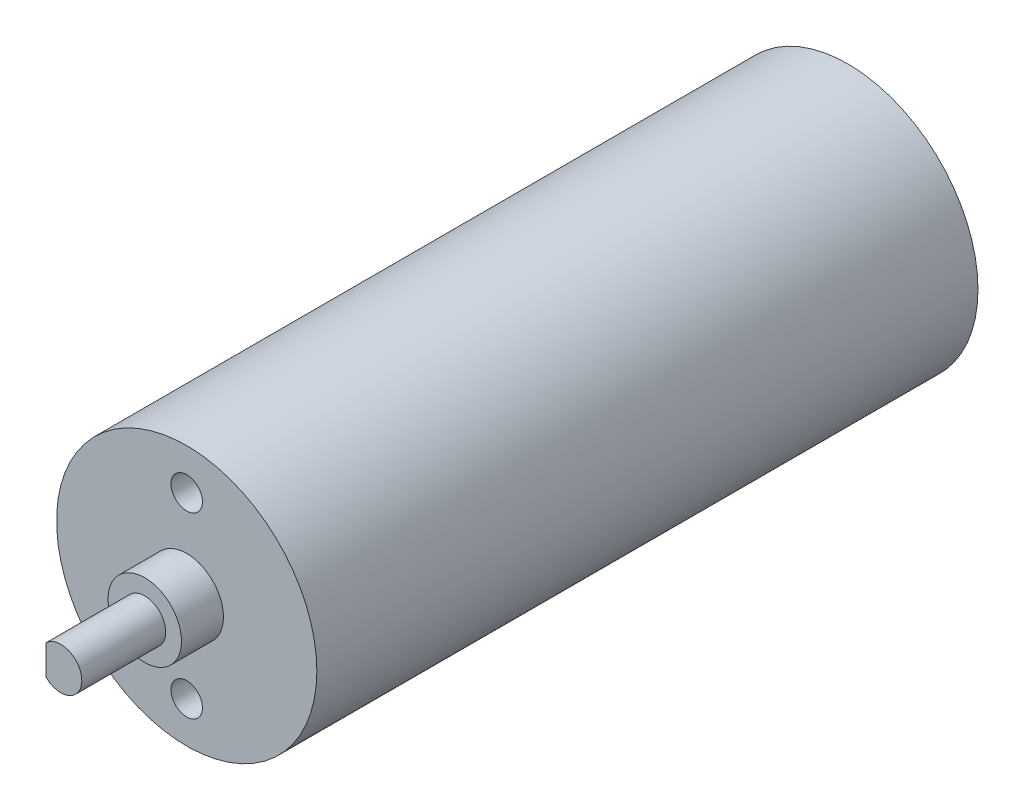
ISO-10303-21;
HEADER;
FILE_DESCRIPTION(('STEP AP214'),'2;1');
FILE_NAME('part.step','',(''),(''),'','','');
FILE_SCHEMA(('AUTOMOTIVE_DESIGN { 1 0 10303 214 1 1 1 1 }'));
ENDSEC;
DATA;
#1=APPLICATION_CONTEXT('core data for automotive mechanical design processes');
#2=APPLICATION_PROTOCOL_DEFINITION('international standard','automotive_design',2000,#1);
#3=PRODUCT_CONTEXT('',#1,'mechanical');
#4=PRODUCT('Part','Part','',(#3));
#5=PRODUCT_RELATED_PRODUCT_CATEGORY('part','',(#4));
#6=PRODUCT_DEFINITION_FORMATION('','',#4);
#7=PRODUCT_DEFINITION_CONTEXT('part definition',#1,'design');
#8=PRODUCT_DEFINITION('design','',#6,#7);
#9=PRODUCT_DEFINITION_SHAPE('','',#8);
#10=(LENGTH_UNIT() NAMED_UNIT(*) SI_UNIT(.MILLI.,.METRE.));
#11=(NAMED_UNIT(*) PLANE_ANGLE_UNIT() SI_UNIT($,.RADIAN.));
#12=(NAMED_UNIT(*) SI_UNIT($,.STERADIAN.) SOLID_ANGLE_UNIT());
#13=UNCERTAINTY_MEASURE_WITH_UNIT(LENGTH_MEASURE(1.E-05),#10,'distance_accuracy_value','');
#14=(GEOMETRIC_REPRESENTATION_CONTEXT(3) GLOBAL_UNCERTAINTY_ASSIGNED_CONTEXT((#13)) GLOBAL_UNIT_ASSIGNED_CONTEXT((#10,
#11,#12)) REPRESENTATION_CONTEXT('',''));
#15=CARTESIAN_POINT('',(0.,0.,0.));
#16=DIRECTION('',(0.,0.,1.));
#17=DIRECTION('',(1.,0.,0.));
#18=AXIS2_PLACEMENT_3D('',#15,#16,#17);
#19=CARTESIAN_POINT('',(0.,0.,67.));
#20=DIRECTION('',(0.,0.,1.));
#21=DIRECTION('',(1.,0.,0.));
#22=AXIS2_PLACEMENT_3D('',#19,#20,#21);
#23=PLANE('',#22);
#24=CARTESIAN_POINT('',(0.,0.,67.));
#25=DIRECTION('',(0.,0.,1.));
#26=DIRECTION('',(1.,0.,0.));
#27=AXIS2_PLACEMENT_3D('',#24,#25,#26);
#28=CIRCLE('',#27,3.5);
#29=CARTESIAN_POINT('',(3.5,0.,67.));
#30=VERTEX_POINT('',#29);
#31=EDGE_CURVE('E89',#30,#30,#28,.T.);
#32=ORIENTED_EDGE('',*,*,#31,.T.);
#33=EDGE_LOOP('',(#32));
#34=FACE_BOUND('',#33,.T.);
#35=DIRECTION('',(0.,-1.,0.));
#36=VECTOR('',#35,1.);
#37=CARTESIAN_POINT('',(-1.41,1.4184146079338,67.));
#38=LINE('',#37,#36);
#39=CARTESIAN_POINT('',(-1.41,1.4184146079338,67.));
#40=VERTEX_POINT('',#39);
#41=CARTESIAN_POINT('',(-1.41,-1.4184146079338,67.));
#42=VERTEX_POINT('',#41);
#43=EDGE_CURVE('E69',#40,#42,#38,.T.);
#44=ORIENTED_EDGE('',*,*,#43,.F.);
#45=CARTESIAN_POINT('',(0.,0.,67.));
#46=DIRECTION('',(0.,0.,1.));
#47=DIRECTION('',(1.,0.,0.));
#48=AXIS2_PLACEMENT_3D('',#45,#46,#47);
#49=CIRCLE('',#48,2.);
#50=EDGE_CURVE('E54',#42,#40,#49,.T.);
#51=ORIENTED_EDGE('',*,*,#50,.F.);
#52=EDGE_LOOP('',(#44,#51));
#53=FACE_BOUND('',#52,.T.);
#54=ADVANCED_FACE('F39',(#34,#53),#23,.T.);
#55=CARTESIAN_POINT('',(0.,0.,63.));
#56=DIRECTION('',(0.,0.,-1.));
#57=DIRECTION('',(-1.,0.,0.));
#58=AXIS2_PLACEMENT_3D('',#55,#56,#57);
#59=CYLINDRICAL_SURFACE('',#58,12.4);
#60=CARTESIAN_POINT('',(0.,0.,63.));
#61=DIRECTION('',(0.,0.,1.));
#62=DIRECTION('',(1.,0.,0.));
#63=AXIS2_PLACEMENT_3D('',#60,#61,#62);
#64=CIRCLE('',#63,12.4);
#65=CARTESIAN_POINT('',(12.4,0.,63.));
#66=VERTEX_POINT('',#65);
#67=EDGE_CURVE('E11',#66,#66,#64,.T.);
#68=ORIENTED_EDGE('',*,*,#67,.F.);
#69=EDGE_LOOP('',(#68));
#70=FACE_BOUND('',#69,.T.);
#71=CARTESIAN_POINT('',(0.,0.,0.));
#72=DIRECTION('',(0.,0.,1.));
#73=DIRECTION('',(1.,0.,0.));
#74=AXIS2_PLACEMENT_3D('',#71,#72,#73);
#75=CIRCLE('',#74,12.4);
#76=CARTESIAN_POINT('',(12.4,0.,0.));
#77=VERTEX_POINT('',#76);
#78=EDGE_CURVE('E43',#77,#77,#75,.T.);
#79=ORIENTED_EDGE('',*,*,#78,.T.);
#80=EDGE_LOOP('',(#79));
#81=FACE_BOUND('',#80,.T.);
#82=ADVANCED_FACE('F41',(#70,#81),#59,.T.);
#83=CARTESIAN_POINT('',(0.,0.,63.));
#84=DIRECTION('',(0.,0.,1.));
#85=DIRECTION('',(1.,0.,0.));
#86=AXIS2_PLACEMENT_3D('',#83,#84,#85);
#87=PLANE('',#86);
#88=CARTESIAN_POINT('',(0.,8.5,63.));
#89=DIRECTION('',(0.,0.,1.));
#90=DIRECTION('',(1.,0.,0.));
#91=AXIS2_PLACEMENT_3D('',#88,#89,#90);
#92=CIRCLE('',#91,1.5);
#93=CARTESIAN_POINT('',(1.5,8.5,63.));
#94=VERTEX_POINT('',#93);
#95=EDGE_CURVE('E149',#94,#94,#92,.T.);
#96=ORIENTED_EDGE('',*,*,#95,.F.);
#97=EDGE_LOOP('',(#96));
#98=FACE_BOUND('',#97,.T.);
#99=CARTESIAN_POINT('',(0.,-8.5,63.));
#100=DIRECTION('',(0.,0.,1.));
#101=DIRECTION('',(1.,0.,0.));
#102=AXIS2_PLACEMENT_3D('',#99,#100,#101);
#103=CIRCLE('',#102,1.5);
#104=CARTESIAN_POINT('',(1.5,-8.5,63.));
#105=VERTEX_POINT('',#104);
#106=EDGE_CURVE('E82',#105,#105,#103,.T.);
#107=ORIENTED_EDGE('',*,*,#106,.F.);
#108=EDGE_LOOP('',(#107));
#109=FACE_BOUND('',#108,.T.);
#110=CARTESIAN_POINT('',(0.,0.,63.));
#111=DIRECTION('',(0.,0.,1.));
#112=DIRECTION('',(1.,0.,0.));
#113=AXIS2_PLACEMENT_3D('',#110,#111,#112);
#114=CIRCLE('',#113,3.5);
#115=CARTESIAN_POINT('',(3.5,0.,63.));
#116=VERTEX_POINT('',#115);
#117=EDGE_CURVE('E88',#116,#116,#114,.T.);
#118=ORIENTED_EDGE('',*,*,#117,.F.);
#119=EDGE_LOOP('',(#118));
#120=FACE_BOUND('',#119,.T.);
#121=ORIENTED_EDGE('',*,*,#67,.T.);
#122=EDGE_LOOP('',(#121));
#123=FACE_BOUND('',#122,.T.);
#124=ADVANCED_FACE('F97',(#98,#109,#120,#123),#87,.T.);
#125=CARTESIAN_POINT('',(0.,0.,0.));
#126=DIRECTION('',(0.,0.,1.));
#127=DIRECTION('',(1.,0.,0.));
#128=AXIS2_PLACEMENT_3D('',#125,#126,#127);
#129=PLANE('',#128);
#130=ORIENTED_EDGE('',*,*,#78,.F.);
#131=EDGE_LOOP('',(#130));
#132=FACE_BOUND('',#131,.T.);
#133=ADVANCED_FACE('F100',(#132),#129,.F.);
#134=CARTESIAN_POINT('',(0.,0.,67.));
#135=DIRECTION('',(0.,0.,-1.));
#136=DIRECTION('',(-1.,0.,0.));
#137=AXIS2_PLACEMENT_3D('',#134,#135,#136);
#138=CYLINDRICAL_SURFACE('',#137,3.5);
#139=ORIENTED_EDGE('',*,*,#31,.F.);
#140=EDGE_LOOP('',(#139));
#141=FACE_BOUND('',#140,.T.);
#142=ORIENTED_EDGE('',*,*,#117,.T.);
#143=EDGE_LOOP('',(#142));
#144=FACE_BOUND('',#143,.T.);
#145=ADVANCED_FACE('F95',(#141,#144),#138,.T.);
#146=CARTESIAN_POINT('',(0.,0.,75.));
#147=DIRECTION('',(0.,0.,-1.));
#148=DIRECTION('',(-1.,0.,0.));
#149=AXIS2_PLACEMENT_3D('',#146,#147,#148);
#150=CYLINDRICAL_SURFACE('',#149,2.);
#151=ORIENTED_EDGE('',*,*,#50,.T.);
#152=DIRECTION('',(0.,0.,-1.));
#153=VECTOR('',#152,1.);
#154=CARTESIAN_POINT('',(-1.41,1.4184146079338,75.));
#155=LINE('',#154,#153);
#156=CARTESIAN_POINT('',(-1.41,1.4184146079338,75.));
#157=VERTEX_POINT('',#156);
#158=EDGE_CURVE('E73',#157,#40,#155,.T.);
#159=ORIENTED_EDGE('',*,*,#158,.F.);
#160=CARTESIAN_POINT('',(0.,0.,75.));
#161=DIRECTION('',(0.,0.,1.));
#162=DIRECTION('',(1.,0.,0.));
#163=AXIS2_PLACEMENT_3D('',#160,#161,#162);
#164=CIRCLE('',#163,2.);
#165=CARTESIAN_POINT('',(-1.41,-1.4184146079338,75.));
#166=VERTEX_POINT('',#165);
#167=EDGE_CURVE('E75',#166,#157,#164,.T.);
#168=ORIENTED_EDGE('',*,*,#167,.F.);
#169=DIRECTION('',(0.,0.,-1.));
#170=VECTOR('',#169,1.);
#171=CARTESIAN_POINT('',(-1.41,-1.4184146079338,75.));
#172=LINE('',#171,#170);
#173=EDGE_CURVE('E71',#166,#42,#172,.T.);
#174=ORIENTED_EDGE('',*,*,#173,.T.);
#175=EDGE_LOOP('',(#151,#159,#168,#174));
#176=FACE_BOUND('',#175,.T.);
#177=ADVANCED_FACE('F77',(#176),#150,.T.);
#178=CARTESIAN_POINT('',(-1.41,1.4184146079338,75.));
#179=DIRECTION('',(1.,0.,0.));
#180=DIRECTION('',(0.,1.,0.));
#181=AXIS2_PLACEMENT_3D('',#178,#179,#180);
#182=PLANE('',#181);
#183=ORIENTED_EDGE('',*,*,#43,.T.);
#184=ORIENTED_EDGE('',*,*,#173,.F.);
#185=DIRECTION('',(0.,-1.,0.));
#186=VECTOR('',#185,1.);
#187=CARTESIAN_POINT('',(-1.41,1.4184146079338,75.));
#188=LINE('',#187,#186);
#189=EDGE_CURVE('E62',#157,#166,#188,.T.);
#190=ORIENTED_EDGE('',*,*,#189,.F.);
#191=ORIENTED_EDGE('',*,*,#158,.T.);
#192=EDGE_LOOP('',(#183,#184,#190,#191));
#193=FACE_BOUND('',#192,.T.);
#194=ADVANCED_FACE('F70',(#193),#182,.F.);
#195=CARTESIAN_POINT('',(0.,0.,75.));
#196=DIRECTION('',(0.,0.,1.));
#197=DIRECTION('',(1.,0.,0.));
#198=AXIS2_PLACEMENT_3D('',#195,#196,#197);
#199=PLANE('',#198);
#200=ORIENTED_EDGE('',*,*,#167,.T.);
#201=ORIENTED_EDGE('',*,*,#189,.T.);
#202=EDGE_LOOP('',(#200,#201));
#203=FACE_BOUND('',#202,.T.);
#204=ADVANCED_FACE('F126',(#203),#199,.T.);
#205=CARTESIAN_POINT('',(0.,-8.5,53.));
#206=DIRECTION('',(0.,0.,1.));
#207=DIRECTION('',(1.,0.,0.));
#208=AXIS2_PLACEMENT_3D('',#205,#206,#207);
#209=CYLINDRICAL_SURFACE('',#208,1.5);
#210=CARTESIAN_POINT('',(0.,-8.5,53.));
#211=DIRECTION('',(0.,0.,1.));
#212=DIRECTION('',(1.,0.,0.));
#213=AXIS2_PLACEMENT_3D('',#210,#211,#212);
#214=CIRCLE('',#213,1.5);
#215=CARTESIAN_POINT('',(1.5,-8.5,53.));
#216=VERTEX_POINT('',#215);
#217=EDGE_CURVE('E79',#216,#216,#214,.T.);
#218=ORIENTED_EDGE('',*,*,#217,.F.);
#219=EDGE_LOOP('',(#218));
#220=FACE_BOUND('',#219,.T.);
#221=ORIENTED_EDGE('',*,*,#106,.T.);
#222=EDGE_LOOP('',(#221));
#223=FACE_BOUND('',#222,.T.);
#224=ADVANCED_FACE('F129',(#220,#223),#209,.F.);
#225=CARTESIAN_POINT('',(0.,-8.5,53.));
#226=DIRECTION('',(0.,0.,1.));
#227=DIRECTION('',(1.,0.,0.));
#228=AXIS2_PLACEMENT_3D('',#225,#226,#227);
#229=PLANE('',#228);
#230=ORIENTED_EDGE('',*,*,#217,.T.);
#231=EDGE_LOOP('',(#230));
#232=FACE_BOUND('',#231,.T.);
#233=ADVANCED_FACE('F132',(#232),#229,.T.);
#234=CARTESIAN_POINT('',(0.,8.5,53.));
#235=DIRECTION('',(0.,0.,1.));
#236=DIRECTION('',(1.,0.,0.));
#237=AXIS2_PLACEMENT_3D('',#234,#235,#236);
#238=CYLINDRICAL_SURFACE('',#237,1.5);
#239=CARTESIAN_POINT('',(0.,8.5,53.));
#240=DIRECTION('',(0.,0.,1.));
#241=DIRECTION('',(1.,0.,0.));
#242=AXIS2_PLACEMENT_3D('',#239,#240,#241);
#243=CIRCLE('',#242,1.5);
#244=CARTESIAN_POINT('',(1.5,8.5,53.));
#245=VERTEX_POINT('',#244);
#246=EDGE_CURVE('E148',#245,#245,#243,.T.);
#247=ORIENTED_EDGE('',*,*,#246,.F.);
#248=EDGE_LOOP('',(#247));
#249=FACE_BOUND('',#248,.T.);
#250=ORIENTED_EDGE('',*,*,#95,.T.);
#251=EDGE_LOOP('',(#250));
#252=FACE_BOUND('',#251,.T.);
#253=ADVANCED_FACE('F136',(#249,#252),#238,.F.);
#254=CARTESIAN_POINT('',(0.,8.5,53.));
#255=DIRECTION('',(0.,0.,1.));
#256=DIRECTION('',(1.,0.,0.));
#257=AXIS2_PLACEMENT_3D('',#254,#255,#256);
#258=PLANE('',#257);
#259=ORIENTED_EDGE('',*,*,#246,.T.);
#260=EDGE_LOOP('',(#259));
#261=FACE_BOUND('',#260,.T.);
#262=ADVANCED_FACE('F140',(#261),#258,.T.);
#263=CLOSED_SHELL('',(#54,#82,#124,#133,#145,#177,#194,#204,#224,#233,#253,#262));
#264=MANIFOLD_SOLID_BREP('B2',#263);
#265=ADVANCED_BREP_SHAPE_REPRESENTATION('',(#18,#264),#14);
#266=SHAPE_DEFINITION_REPRESENTATION(#9,#265);
ENDSEC;
END-ISO-10303-21;
